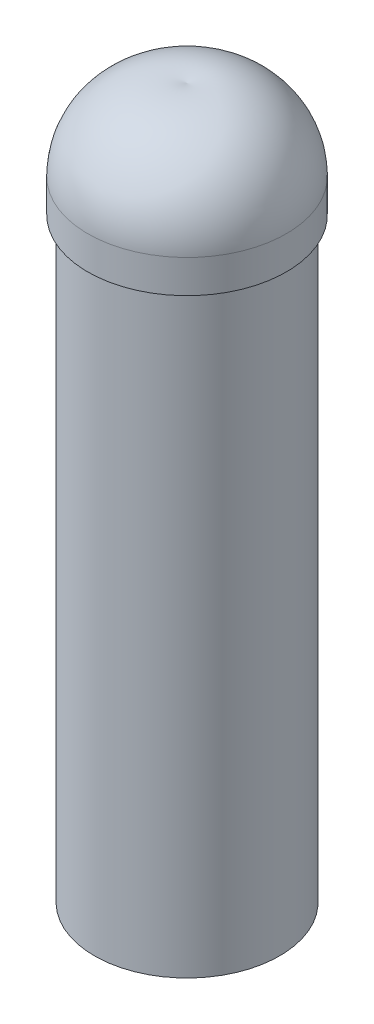
ISO-10303-21;
HEADER;
FILE_DESCRIPTION(('STEP AP214'),'2;1');
FILE_NAME('part.step','',(''),(''),'','','');
FILE_SCHEMA(('AUTOMOTIVE_DESIGN { 1 0 10303 214 1 1 1 1 }'));
ENDSEC;
DATA;
#1=APPLICATION_CONTEXT('core data for automotive mechanical design processes');
#2=APPLICATION_PROTOCOL_DEFINITION('international standard','automotive_design',2000,#1);
#3=PRODUCT_CONTEXT('',#1,'mechanical');
#4=PRODUCT('Part','Part','',(#3));
#5=PRODUCT_RELATED_PRODUCT_CATEGORY('part','',(#4));
#6=PRODUCT_DEFINITION_FORMATION('','',#4);
#7=PRODUCT_DEFINITION_CONTEXT('part definition',#1,'design');
#8=PRODUCT_DEFINITION('design','',#6,#7);
#9=PRODUCT_DEFINITION_SHAPE('','',#8);
#10=(LENGTH_UNIT() NAMED_UNIT(*) SI_UNIT(.MILLI.,.METRE.));
#11=(NAMED_UNIT(*) PLANE_ANGLE_UNIT() SI_UNIT($,.RADIAN.));
#12=(NAMED_UNIT(*) SI_UNIT($,.STERADIAN.) SOLID_ANGLE_UNIT());
#13=UNCERTAINTY_MEASURE_WITH_UNIT(LENGTH_MEASURE(1.E-05),#10,'distance_accuracy_value','');
#14=(GEOMETRIC_REPRESENTATION_CONTEXT(3) GLOBAL_UNCERTAINTY_ASSIGNED_CONTEXT((#13)) GLOBAL_UNIT_ASSIGNED_CONTEXT((#10,
#11,#12)) REPRESENTATION_CONTEXT('',''));
#15=CARTESIAN_POINT('',(0.,0.,0.));
#16=DIRECTION('',(0.,0.,1.));
#17=DIRECTION('',(1.,0.,0.));
#18=AXIS2_PLACEMENT_3D('',#15,#16,#17);
#19=CARTESIAN_POINT('',(-0.450000000000001,14.1120909198847,0.));
#20=DIRECTION('',(0.,0.,-1.));
#21=DIRECTION('',(-1.,0.,0.));
#22=AXIS2_PLACEMENT_3D('',#19,#20,#21);
#23=CIRCLE('',#22,2.5);
#24=TRIMMED_CURVE('',#23,(PARAMETER_VALUE(-1.77215424758523)),
(PARAMETER_VALUE(1.77215424758523)),.T.,.PARAMETER.);
#25=CARTESIAN_POINT('',(0.0499999999999987,14.1120909198847,0.));
#26=DIRECTION('',(0.,1.,0.));
#27=AXIS1_PLACEMENT('',#25,#26);
#28=SURFACE_OF_REVOLUTION('',#24,#27);
#29=CARTESIAN_POINT('',(0.0499999999999984,16.5615806626679,0.));
#30=VERTEX_POINT('',#29);
#31=VERTEX_LOOP('',#30);
#32=FACE_BOUND('',#31,.T.);
#33=CARTESIAN_POINT('',(0.0499999999999987,14.1120909198847,0.));
#34=DIRECTION('',(0.,1.,0.));
#35=DIRECTION('',(-1.,0.,0.));
#36=AXIS2_PLACEMENT_3D('',#33,#34,#35);
#37=CIRCLE('',#36,3.);
#38=CARTESIAN_POINT('',(-2.95,14.1120909198847,0.));
#39=VERTEX_POINT('',#38);
#40=EDGE_CURVE('E11',#39,#39,#37,.T.);
#41=ORIENTED_EDGE('',*,*,#40,.T.);
#42=EDGE_LOOP('',(#41));
#43=FACE_BOUND('',#42,.T.);
#44=ADVANCED_FACE('F41',(#32,#43),#28,.T.);
#45=CARTESIAN_POINT('',(0.0499999999999984,16.5615806626679,0.));
#46=DIRECTION('',(0.,1.,0.));
#47=DIRECTION('',(-1.,0.,0.));
#48=AXIS2_PLACEMENT_3D('',#45,#46,#47);
#49=CYLINDRICAL_SURFACE('',#48,3.);
#50=CARTESIAN_POINT('',(0.0499999999999988,13.1120909198847,0.));
#51=DIRECTION('',(0.,1.,0.));
#52=DIRECTION('',(-1.,0.,0.));
#53=AXIS2_PLACEMENT_3D('',#50,#51,#52);
#54=CIRCLE('',#53,3.);
#55=CARTESIAN_POINT('',(-2.95,13.1120909198847,0.));
#56=VERTEX_POINT('',#55);
#57=EDGE_CURVE('E48',#56,#56,#54,.T.);
#58=ORIENTED_EDGE('',*,*,#57,.T.);
#59=EDGE_LOOP('',(#58));
#60=FACE_BOUND('',#59,.T.);
#61=ORIENTED_EDGE('',*,*,#40,.F.);
#62=EDGE_LOOP('',(#61));
#63=FACE_BOUND('',#62,.T.);
#64=ADVANCED_FACE('F53',(#60,#63),#49,.T.);
#65=CARTESIAN_POINT('',(0.,13.1120909198847,0.));
#66=DIRECTION('',(0.,-1.,0.));
#67=DIRECTION('',(1.,0.,0.));
#68=AXIS2_PLACEMENT_3D('',#65,#66,#67);
#69=PLANE('',#68);
#70=CARTESIAN_POINT('',(0.0499999999999988,13.1120909198847,0.));
#71=DIRECTION('',(0.,1.,0.));
#72=DIRECTION('',(-1.,0.,0.));
#73=AXIS2_PLACEMENT_3D('',#70,#71,#72);
#74=CIRCLE('',#73,2.8);
#75=CARTESIAN_POINT('',(-2.75,13.1120909198847,0.));
#76=VERTEX_POINT('',#75);
#77=EDGE_CURVE('E97',#76,#76,#74,.T.);
#78=ORIENTED_EDGE('',*,*,#77,.T.);
#79=EDGE_LOOP('',(#78));
#80=FACE_BOUND('',#79,.T.);
#81=ORIENTED_EDGE('',*,*,#57,.F.);
#82=EDGE_LOOP('',(#81));
#83=FACE_BOUND('',#82,.T.);
#84=ADVANCED_FACE('F57',(#80,#83),#69,.T.);
#85=CARTESIAN_POINT('',(0.0499999999999984,16.5615806626679,0.));
#86=DIRECTION('',(0.,1.,0.));
#87=DIRECTION('',(-1.,0.,0.));
#88=AXIS2_PLACEMENT_3D('',#85,#86,#87);
#89=CYLINDRICAL_SURFACE('',#88,2.8);
#90=CARTESIAN_POINT('',(0.050000000000001,-4.88790908011526,0.));
#91=DIRECTION('',(0.,1.,0.));
#92=DIRECTION('',(-1.,0.,0.));
#93=AXIS2_PLACEMENT_3D('',#90,#91,#92);
#94=CIRCLE('',#93,2.8);
#95=CARTESIAN_POINT('',(-2.75,-4.88790908011526,0.));
#96=VERTEX_POINT('',#95);
#97=EDGE_CURVE('E91',#96,#96,#94,.T.);
#98=ORIENTED_EDGE('',*,*,#97,.T.);
#99=EDGE_LOOP('',(#98));
#100=FACE_BOUND('',#99,.T.);
#101=ORIENTED_EDGE('',*,*,#77,.F.);
#102=EDGE_LOOP('',(#101));
#103=FACE_BOUND('',#102,.T.);
#104=ADVANCED_FACE('F62',(#100,#103),#89,.T.);
#105=CARTESIAN_POINT('',(0.,-4.88790908011526,0.));
#106=DIRECTION('',(0.,-1.,0.));
#107=DIRECTION('',(1.,0.,0.));
#108=AXIS2_PLACEMENT_3D('',#105,#106,#107);
#109=PLANE('',#108);
#110=CARTESIAN_POINT('',(0.050000000000001,-4.88790908011526,0.));
#111=DIRECTION('',(0.,1.,0.));
#112=DIRECTION('',(-1.,0.,0.));
#113=AXIS2_PLACEMENT_3D('',#110,#111,#112);
#114=CIRCLE('',#113,1.6);
#115=CARTESIAN_POINT('',(-1.55,-4.88790908011526,0.));
#116=VERTEX_POINT('',#115);
#117=EDGE_CURVE('E87',#116,#116,#114,.T.);
#118=ORIENTED_EDGE('',*,*,#117,.T.);
#119=EDGE_LOOP('',(#118));
#120=FACE_BOUND('',#119,.T.);
#121=ORIENTED_EDGE('',*,*,#97,.F.);
#122=EDGE_LOOP('',(#121));
#123=FACE_BOUND('',#122,.T.);
#124=ADVANCED_FACE('F69',(#120,#123),#109,.T.);
#125=CARTESIAN_POINT('',(0.0499999999999984,16.5615806626679,0.));
#126=DIRECTION('',(0.,1.,0.));
#127=DIRECTION('',(-1.,0.,0.));
#128=AXIS2_PLACEMENT_3D('',#125,#126,#127);
#129=CYLINDRICAL_SURFACE('',#128,1.6);
#130=CARTESIAN_POINT('',(0.0500000000000001,2.26229508196721,0.));
#131=DIRECTION('',(0.,1.,0.));
#132=DIRECTION('',(-1.,0.,0.));
#133=AXIS2_PLACEMENT_3D('',#130,#131,#132);
#134=CIRCLE('',#133,1.6);
#135=CARTESIAN_POINT('',(-1.55,2.26229508196721,0.));
#136=VERTEX_POINT('',#135);
#137=EDGE_CURVE('E85',#136,#136,#134,.T.);
#138=ORIENTED_EDGE('',*,*,#137,.T.);
#139=EDGE_LOOP('',(#138));
#140=FACE_BOUND('',#139,.T.);
#141=ORIENTED_EDGE('',*,*,#117,.F.);
#142=EDGE_LOOP('',(#141));
#143=FACE_BOUND('',#142,.T.);
#144=ADVANCED_FACE('F73',(#140,#143),#129,.F.);
#145=CARTESIAN_POINT('',(0.,2.26229508196721,0.));
#146=DIRECTION('',(0.,-1.,0.));
#147=DIRECTION('',(1.,0.,0.));
#148=AXIS2_PLACEMENT_3D('',#145,#146,#147);
#149=PLANE('',#148);
#150=ORIENTED_EDGE('',*,*,#137,.F.);
#151=EDGE_LOOP('',(#150));
#152=FACE_BOUND('',#151,.T.);
#153=ADVANCED_FACE('F77',(#152),#149,.T.);
#154=CLOSED_SHELL('',(#44,#64,#84,#104,#124,#144,#153));
#155=MANIFOLD_SOLID_BREP('B2',#154);
#156=ADVANCED_BREP_SHAPE_REPRESENTATION('',(#18,#155),#14);
#157=SHAPE_DEFINITION_REPRESENTATION(#9,#156);
ENDSEC;
END-ISO-10303-21;
